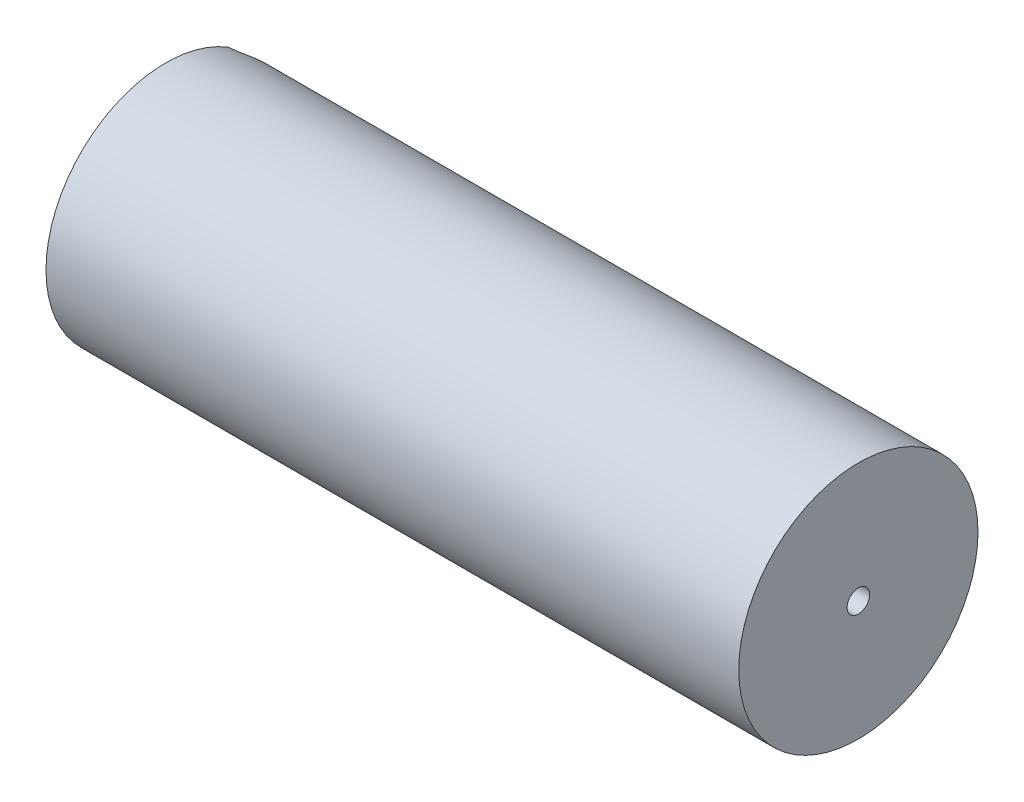
ISO-10303-21;
HEADER;
FILE_DESCRIPTION(('STEP AP214'),'2;1');
FILE_NAME('part.step','',(''),(''),'','','');
FILE_SCHEMA(('AUTOMOTIVE_DESIGN { 1 0 10303 214 1 1 1 1 }'));
ENDSEC;
DATA;
#1=APPLICATION_CONTEXT('core data for automotive mechanical design processes');
#2=APPLICATION_PROTOCOL_DEFINITION('international standard','automotive_design',2000,#1);
#3=PRODUCT_CONTEXT('',#1,'mechanical');
#4=PRODUCT('Part','Part','',(#3));
#5=PRODUCT_RELATED_PRODUCT_CATEGORY('part','',(#4));
#6=PRODUCT_DEFINITION_FORMATION('','',#4);
#7=PRODUCT_DEFINITION_CONTEXT('part definition',#1,'design');
#8=PRODUCT_DEFINITION('design','',#6,#7);
#9=PRODUCT_DEFINITION_SHAPE('','',#8);
#10=(LENGTH_UNIT() NAMED_UNIT(*) SI_UNIT(.MILLI.,.METRE.));
#11=(NAMED_UNIT(*) PLANE_ANGLE_UNIT() SI_UNIT($,.RADIAN.));
#12=(NAMED_UNIT(*) SI_UNIT($,.STERADIAN.) SOLID_ANGLE_UNIT());
#13=UNCERTAINTY_MEASURE_WITH_UNIT(LENGTH_MEASURE(1.E-05),#10,'distance_accuracy_value','');
#14=(GEOMETRIC_REPRESENTATION_CONTEXT(3) GLOBAL_UNCERTAINTY_ASSIGNED_CONTEXT((#13)) GLOBAL_UNIT_ASSIGNED_CONTEXT((#10,
#11,#12)) REPRESENTATION_CONTEXT('',''));
#15=CARTESIAN_POINT('',(0.,0.,0.));
#16=DIRECTION('',(0.,0.,1.));
#17=DIRECTION('',(1.,0.,0.));
#18=AXIS2_PLACEMENT_3D('',#15,#16,#17);
#19=CARTESIAN_POINT('',(0.,26.5,0.));
#20=DIRECTION('',(1.,0.,0.));
#21=DIRECTION('',(0.,0.,-1.));
#22=AXIS2_PLACEMENT_3D('',#19,#20,#21);
#23=PLANE('',#22);
#24=CARTESIAN_POINT('',(0.,0.,0.));
#25=DIRECTION('',(-1.,0.,0.));
#26=DIRECTION('',(0.,0.,1.));
#27=AXIS2_PLACEMENT_3D('',#24,#25,#26);
#28=CIRCLE('',#27,26.5);
#29=CARTESIAN_POINT('',(0.,15.5,-21.4941852602047));
#30=VERTEX_POINT('',#29);
#31=CARTESIAN_POINT('',(0.,22.5,-14.));
#32=VERTEX_POINT('',#31);
#33=EDGE_CURVE('E69',#30,#32,#28,.T.);
#34=ORIENTED_EDGE('',*,*,#33,.T.);
#35=DIRECTION('',(0.,0.,1.));
#36=VECTOR('',#35,1.);
#37=CARTESIAN_POINT('',(0.,22.5,-230.2104));
#38=LINE('',#37,#36);
#39=CARTESIAN_POINT('',(0.,22.5,0.));
#40=VERTEX_POINT('',#39);
#41=EDGE_CURVE('E49',#32,#40,#38,.T.);
#42=ORIENTED_EDGE('',*,*,#41,.T.);
#43=DIRECTION('',(0.,-1.,0.));
#44=VECTOR('',#43,1.);
#45=CARTESIAN_POINT('',(0.,26.5,0.));
#46=LINE('',#45,#44);
#47=CARTESIAN_POINT('',(0.,15.5,0.));
#48=VERTEX_POINT('',#47);
#49=EDGE_CURVE('E11',#40,#48,#46,.T.);
#50=ORIENTED_EDGE('',*,*,#49,.T.);
#51=DIRECTION('',(0.,0.,1.));
#52=VECTOR('',#51,1.);
#53=CARTESIAN_POINT('',(0.,15.5,-230.2104));
#54=LINE('',#53,#52);
#55=EDGE_CURVE('E64',#48,#30,#54,.F.);
#56=ORIENTED_EDGE('',*,*,#55,.T.);
#57=EDGE_LOOP('',(#34,#42,#50,#56));
#58=FACE_BOUND('',#57,.T.);
#59=CARTESIAN_POINT('',(0.,0.,0.));
#60=DIRECTION('',(-1.,0.,0.));
#61=DIRECTION('',(0.,0.,1.));
#62=AXIS2_PLACEMENT_3D('',#59,#60,#61);
#63=CIRCLE('',#62,2.5);
#64=CARTESIAN_POINT('',(0.,0.,2.5));
#65=VERTEX_POINT('',#64);
#66=EDGE_CURVE('E80',#65,#65,#63,.T.);
#67=ORIENTED_EDGE('',*,*,#66,.F.);
#68=EDGE_LOOP('',(#67));
#69=FACE_BOUND('',#68,.T.);
#70=ADVANCED_FACE('F35',(#58,#69),#23,.F.);
#71=CARTESIAN_POINT('',(0.,0.,0.));
#72=DIRECTION('',(-1.,0.,0.));
#73=DIRECTION('',(0.,0.,1.));
#74=AXIS2_PLACEMENT_3D('',#71,#72,#73);
#75=CYLINDRICAL_SURFACE('',#74,2.5);
#76=CARTESIAN_POINT('',(153.4736,0.,0.));
#77=DIRECTION('',(-1.,0.,0.));
#78=DIRECTION('',(0.,0.,1.));
#79=AXIS2_PLACEMENT_3D('',#76,#77,#78);
#80=CIRCLE('',#79,2.5);
#81=CARTESIAN_POINT('',(153.4736,0.,2.5));
#82=VERTEX_POINT('',#81);
#83=EDGE_CURVE('E77',#82,#82,#80,.T.);
#84=ORIENTED_EDGE('',*,*,#83,.F.);
#85=EDGE_LOOP('',(#84));
#86=FACE_BOUND('',#85,.T.);
#87=ORIENTED_EDGE('',*,*,#66,.T.);
#88=EDGE_LOOP('',(#87));
#89=FACE_BOUND('',#88,.T.);
#90=ADVANCED_FACE('F101',(#86,#89),#75,.F.);
#91=CARTESIAN_POINT('',(153.4736,2.5,0.));
#92=DIRECTION('',(-1.,0.,0.));
#93=DIRECTION('',(0.,0.,1.));
#94=AXIS2_PLACEMENT_3D('',#91,#92,#93);
#95=PLANE('',#94);
#96=CARTESIAN_POINT('',(153.4736,0.,0.));
#97=DIRECTION('',(-1.,0.,0.));
#98=DIRECTION('',(0.,0.,1.));
#99=AXIS2_PLACEMENT_3D('',#96,#97,#98);
#100=CIRCLE('',#99,26.5);
#101=CARTESIAN_POINT('',(153.4736,0.,26.5));
#102=VERTEX_POINT('',#101);
#103=EDGE_CURVE('E71',#102,#102,#100,.T.);
#104=ORIENTED_EDGE('',*,*,#103,.F.);
#105=EDGE_LOOP('',(#104));
#106=FACE_BOUND('',#105,.T.);
#107=ORIENTED_EDGE('',*,*,#83,.T.);
#108=EDGE_LOOP('',(#107));
#109=FACE_BOUND('',#108,.T.);
#110=ADVANCED_FACE('F98',(#106,#109),#95,.F.);
#111=CARTESIAN_POINT('',(0.,0.,0.));
#112=DIRECTION('',(-1.,0.,0.));
#113=DIRECTION('',(0.,0.,1.));
#114=AXIS2_PLACEMENT_3D('',#111,#112,#113);
#115=CYLINDRICAL_SURFACE('',#114,26.5);
#116=ORIENTED_EDGE('',*,*,#33,.F.);
#117=CARTESIAN_POINT('',(0.,15.5,-21.4941852602047));
#118=CARTESIAN_POINT('',(0.0843048857448623,15.4999837318291,-21.4941929247207));
#119=CARTESIAN_POINT('',(0.168600989798791,15.5030455477945,-21.4919889410805));
#120=CARTESIAN_POINT('',(0.33649845348461,15.5152014792557,-21.4832172991668));
#121=CARTESIAN_POINT('',(0.420100057123214,15.5242933767731,-21.4766512453439));
#122=CARTESIAN_POINT('',(0.58559641512782,15.5483279904528,-21.4592568211392));
#123=CARTESIAN_POINT('',(0.667497433040202,15.5632424338813,-21.4484490461003));
#124=CARTESIAN_POINT('',(0.829392773028913,15.5986789096487,-21.4226911088854));
#125=CARTESIAN_POINT('',(0.909387002977484,15.6192012123405,-21.4077407469962));
#126=CARTESIAN_POINT('',(1.14551377371445,15.6887132577979,-21.3569098714082));
#127=CARTESIAN_POINT('',(1.29811237716607,15.7456963072289,-21.3150152160457));
#128=CARTESIAN_POINT('',(1.59009304512158,15.8779199539333,-21.2167011200584));
#129=CARTESIAN_POINT('',(1.72946356989923,15.9531762922459,-21.1602691540862));
#130=CARTESIAN_POINT('',(1.99984761517104,16.1229477371668,-21.031226360315));
#131=CARTESIAN_POINT('',(2.13000531535324,16.2182824833197,-20.9579072326053));
#132=CARTESIAN_POINT('',(2.37184723320349,16.4213701691039,-20.7991649206541));
#133=CARTESIAN_POINT('',(2.48352170702111,16.5291296082302,-20.7137353959184));
#134=CARTESIAN_POINT('',(2.73369675518247,16.8034114172581,-20.49240083665));
#135=CARTESIAN_POINT('',(2.86203514959792,16.9747516704296,-20.3509462617638));
#136=CARTESIAN_POINT('',(3.0813228470834,17.3270736118514,-20.0518356082468));
#137=CARTESIAN_POINT('',(3.17220131115787,17.5080728427224,-19.8941495318937));
#138=CARTESIAN_POINT('',(3.29453879085572,17.8113125819898,-19.6222737028899));
#139=CARTESIAN_POINT('',(3.33569977502947,17.9327518764221,-19.5113805938514));
#140=CARTESIAN_POINT('',(3.4038797468875,18.1756699811704,-19.2852928580342));
#141=CARTESIAN_POINT('',(3.43089437899242,18.2971487921471,-19.170096918121));
#142=CARTESIAN_POINT('',(3.47169726888381,18.5391379407188,-18.9361752665101));
#143=CARTESIAN_POINT('',(3.48547098169524,18.6596470694186,-18.8174458205079));
#144=CARTESIAN_POINT('',(3.50058448865547,18.8987320918673,-18.5773152400615));
#145=CARTESIAN_POINT('',(3.50192429475746,19.0173079874746,-18.4559141081858));
#146=CARTESIAN_POINT('',(3.49174713079037,19.2817860407323,-18.1798778301552));
#147=CARTESIAN_POINT('',(3.47686714091242,19.4269523070711,-18.0246566604146));
#148=CARTESIAN_POINT('',(3.42981041611202,19.7122601968147,-17.7121876965529));
#149=CARTESIAN_POINT('',(3.39762810025556,19.8524001834062,-17.5549392645122));
#150=CARTESIAN_POINT('',(3.31669705510576,20.1269526720364,-17.2394761680495));
#151=CARTESIAN_POINT('',(3.26793426118215,20.2613602021387,-17.0812607956698));
#152=CARTESIAN_POINT('',(3.1542162447757,20.5235963289544,-16.7652651822673));
#153=CARTESIAN_POINT('',(3.08926624804066,20.6514270328418,-16.6074848173985));
#154=CARTESIAN_POINT('',(2.95973836406255,20.8714454182138,-16.3296239875066));
#155=CARTESIAN_POINT('',(2.89846242490066,20.9651064717517,-16.209162222549));
#156=CARTESIAN_POINT('',(2.76586176445996,21.1477309283079,-15.9701622904562));
#157=CARTESIAN_POINT('',(2.69453574412247,21.236693721989,-15.8516243742072));
#158=CARTESIAN_POINT('',(2.54149693701988,21.4091605405367,-15.617902384303));
#159=CARTESIAN_POINT('',(2.45981249438247,21.4926785537638,-15.5027101749224));
#160=CARTESIAN_POINT('',(2.28510976435033,21.6537486320049,-15.2769230448173));
#161=CARTESIAN_POINT('',(2.19209888693246,21.7313045439335,-15.1663251812325));
#162=CARTESIAN_POINT('',(1.98717933164392,21.8841828906873,-14.9449571215493));
#163=CARTESIAN_POINT('',(1.87444324735557,21.9590465869711,-14.8346267516508));
#164=CARTESIAN_POINT('',(1.63290231068849,22.0988843422719,-14.6254941281884));
#165=CARTESIAN_POINT('',(1.50410056489461,22.1638603078816,-14.5266896530141));
#166=CARTESIAN_POINT('',(1.25822172318828,22.2681367596566,-14.3661837429674));
#167=CARTESIAN_POINT('',(1.1444807846511,22.3099586942509,-14.3010608579225));
#168=CARTESIAN_POINT('',(0.90636662639167,22.3828752353893,-14.1866662403543));
#169=CARTESIAN_POINT('',(0.782043327086377,22.4140170653972,-14.137324795196));
#170=CARTESIAN_POINT('',(0.601341482101093,22.4483639178155,-14.0826596545196));
#171=CARTESIAN_POINT('',(0.548568381534013,22.4571641849576,-14.0686169987079));
#172=CARTESIAN_POINT('',(0.441839326040046,22.4724167963395,-14.0442404308573));
#173=CARTESIAN_POINT('',(0.387883748774618,22.4788698789664,-14.0339053524869));
#174=CARTESIAN_POINT('',(0.278538813249239,22.4893351412666,-14.0171291632317));
#175=CARTESIAN_POINT('',(0.223140303044892,22.4933205756751,-14.0107307236115));
#176=CARTESIAN_POINT('',(0.111832650297808,22.4986600571699,-14.0021534326385));
#177=CARTESIAN_POINT('',(0.0559230159211311,22.5000112241034,-13.9999791997938));
#178=CARTESIAN_POINT('',(0.,22.5,-14.));
#179=B_SPLINE_CURVE_WITH_KNOTS('',3,(#117,#118,#119,#120,#121,#122,#123,#124,#125,#126,#127,
#128,#129,#130,#131,#132,#133,#134,#135,#136,#137,#138,#139,#140,#141,#142,#143,#144,#145,#146,
#147,#148,#149,#150,#151,#152,#153,#154,#155,#156,#157,#158,#159,#160,#161,#162,#163,#164,#165,
#166,#167,#168,#169,#170,#171,#172,#173,#174,#175,#176,#177,#178),.UNSPECIFIED.,.F.,.F.,(4,2,2,
2,2,2,2,2,2,2,2,2,2,2,2,2,2,2,2,2,2,2,2,2,2,2,2,2,2,2,4),(0.,0.25281564733427,0.505538355810976,
0.757048875123964,1.00857152180797,1.51064741221315,2.01315734656219,2.54276281983998,
3.07264660342053,3.83822244078641,4.60523945899345,5.11320283352109,5.62132251518887,
6.12999972396168,6.63867644372322,7.27696883648951,7.91546723663238,8.55450860908149,
9.19334394512451,9.68629720436851,10.1793142405768,10.6710102062228,11.1623862056176,
11.685134511637,12.2077818911136,12.6192277965525,13.028830248791,13.1946219077605,
13.3603613660894,13.5278670889279,13.6955558501857),.UNSPECIFIED.);
#180=EDGE_CURVE('E42',#30,#32,#179,.T.);
#181=ORIENTED_EDGE('',*,*,#180,.T.);
#182=EDGE_LOOP('',(#116,#181));
#183=FACE_BOUND('',#182,.T.);
#184=ORIENTED_EDGE('',*,*,#103,.T.);
#185=EDGE_LOOP('',(#184));
#186=FACE_BOUND('',#185,.T.);
#187=ADVANCED_FACE('F88',(#183,#186),#115,.T.);
#188=CARTESIAN_POINT('',(0.,19.,0.));
#189=DIRECTION('',(0.,0.,1.));
#190=DIRECTION('',(1.,0.,0.));
#191=AXIS2_PLACEMENT_3D('',#188,#189,#190);
#192=PLANE('',#191);
#193=CARTESIAN_POINT('',(0.,19.,0.));
#194=DIRECTION('',(0.,0.,1.));
#195=DIRECTION('',(1.,0.,0.));
#196=AXIS2_PLACEMENT_3D('',#193,#194,#195);
#197=CIRCLE('',#196,3.5);
#198=EDGE_CURVE('E61',#48,#40,#197,.T.);
#199=ORIENTED_EDGE('',*,*,#198,.F.);
#200=ORIENTED_EDGE('',*,*,#49,.F.);
#201=EDGE_LOOP('',(#199,#200));
#202=FACE_BOUND('',#201,.T.);
#203=ADVANCED_FACE('F60',(#202),#192,.F.);
#204=CARTESIAN_POINT('',(0.,19.,-230.2104));
#205=DIRECTION('',(0.,0.,1.));
#206=DIRECTION('',(1.,0.,0.));
#207=AXIS2_PLACEMENT_3D('',#204,#205,#206);
#208=CYLINDRICAL_SURFACE('',#207,3.5);
#209=ORIENTED_EDGE('',*,*,#180,.F.);
#210=ORIENTED_EDGE('',*,*,#55,.F.);
#211=ORIENTED_EDGE('',*,*,#198,.T.);
#212=ORIENTED_EDGE('',*,*,#41,.F.);
#213=EDGE_LOOP('',(#209,#210,#211,#212));
#214=FACE_BOUND('',#213,.T.);
#215=ADVANCED_FACE('F63',(#214),#208,.F.);
#216=CLOSED_SHELL('',(#70,#90,#110,#187,#203,#215));
#217=MANIFOLD_SOLID_BREP('B2',#216);
#218=ADVANCED_BREP_SHAPE_REPRESENTATION('',(#18,#217),#14);
#219=SHAPE_DEFINITION_REPRESENTATION(#9,#218);
ENDSEC;
END-ISO-10303-21;
